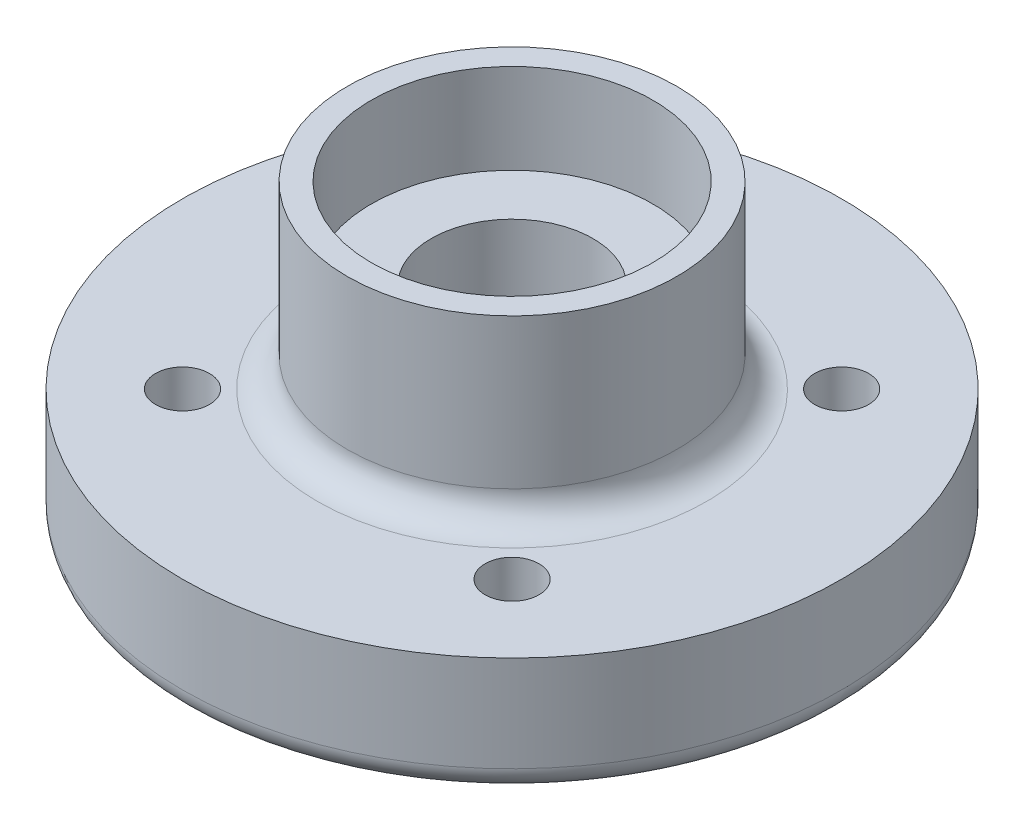
ISO-10303-21;
HEADER;
FILE_DESCRIPTION(('STEP AP214'),'2;1');
FILE_NAME('part.step','',(''),(''),'','','');
FILE_SCHEMA(('AUTOMOTIVE_DESIGN { 1 0 10303 214 1 1 1 1 }'));
ENDSEC;
DATA;
#1=APPLICATION_CONTEXT('core data for automotive mechanical design processes');
#2=APPLICATION_PROTOCOL_DEFINITION('international standard','automotive_design',2000,#1);
#3=PRODUCT_CONTEXT('',#1,'mechanical');
#4=PRODUCT('Part','Part','',(#3));
#5=PRODUCT_RELATED_PRODUCT_CATEGORY('part','',(#4));
#6=PRODUCT_DEFINITION_FORMATION('','',#4);
#7=PRODUCT_DEFINITION_CONTEXT('part definition',#1,'design');
#8=PRODUCT_DEFINITION('design','',#6,#7);
#9=PRODUCT_DEFINITION_SHAPE('','',#8);
#10=(LENGTH_UNIT() NAMED_UNIT(*) SI_UNIT(.MILLI.,.METRE.));
#11=(NAMED_UNIT(*) PLANE_ANGLE_UNIT() SI_UNIT($,.RADIAN.));
#12=(NAMED_UNIT(*) SI_UNIT($,.STERADIAN.) SOLID_ANGLE_UNIT());
#13=UNCERTAINTY_MEASURE_WITH_UNIT(LENGTH_MEASURE(1.E-05),#10,'distance_accuracy_value','');
#14=(GEOMETRIC_REPRESENTATION_CONTEXT(3) GLOBAL_UNCERTAINTY_ASSIGNED_CONTEXT((#13)) GLOBAL_UNIT_ASSIGNED_CONTEXT((#10,
#11,#12)) REPRESENTATION_CONTEXT('',''));
#15=CARTESIAN_POINT('',(0.,0.,0.));
#16=DIRECTION('',(0.,0.,1.));
#17=DIRECTION('',(1.,0.,0.));
#18=AXIS2_PLACEMENT_3D('',#15,#16,#17);
#19=CARTESIAN_POINT('',(0.,0.,0.));
#20=DIRECTION('',(0.,1.,0.));
#21=DIRECTION('',(0.,0.,1.));
#22=AXIS2_PLACEMENT_3D('',#19,#20,#21);
#23=PLANE('',#22);
#24=CARTESIAN_POINT('',(0.,0.,0.));
#25=DIRECTION('',(0.,1.,0.));
#26=DIRECTION('',(0.,0.,1.));
#27=AXIS2_PLACEMENT_3D('',#24,#25,#26);
#28=CIRCLE('',#27,27.5);
#29=CARTESIAN_POINT('',(0.,0.,27.5));
#30=VERTEX_POINT('',#29);
#31=EDGE_CURVE('E11',#30,#30,#28,.T.);
#32=ORIENTED_EDGE('',*,*,#31,.T.);
#33=EDGE_LOOP('',(#32));
#34=FACE_BOUND('',#33,.T.);
#35=CARTESIAN_POINT('',(-27.5,0.,-27.5));
#36=DIRECTION('',(0.,-1.,0.));
#37=DIRECTION('',(0.,0.,-1.));
#38=AXIS2_PLACEMENT_3D('',#35,#36,#37);
#39=CIRCLE('',#38,9.0055);
#40=CARTESIAN_POINT('',(-27.5,0.,-36.5055));
#41=VERTEX_POINT('',#40);
#42=EDGE_CURVE('E79',#41,#41,#39,.T.);
#43=ORIENTED_EDGE('',*,*,#42,.F.);
#44=EDGE_LOOP('',(#43));
#45=FACE_BOUND('',#44,.T.);
#46=CARTESIAN_POINT('',(27.5,0.,-27.5));
#47=DIRECTION('',(0.,-1.,0.));
#48=DIRECTION('',(0.,0.,-1.));
#49=AXIS2_PLACEMENT_3D('',#46,#47,#48);
#50=CIRCLE('',#49,9.0055);
#51=CARTESIAN_POINT('',(27.5,0.,-36.5055));
#52=VERTEX_POINT('',#51);
#53=EDGE_CURVE('E74',#52,#52,#50,.T.);
#54=ORIENTED_EDGE('',*,*,#53,.F.);
#55=EDGE_LOOP('',(#54));
#56=FACE_BOUND('',#55,.T.);
#57=CARTESIAN_POINT('',(27.5,0.,27.5));
#58=DIRECTION('',(0.,-1.,0.));
#59=DIRECTION('',(0.,0.,-1.));
#60=AXIS2_PLACEMENT_3D('',#57,#58,#59);
#61=CIRCLE('',#60,9.0055);
#62=CARTESIAN_POINT('',(27.5,0.,18.4945));
#63=VERTEX_POINT('',#62);
#64=EDGE_CURVE('E69',#63,#63,#61,.T.);
#65=ORIENTED_EDGE('',*,*,#64,.F.);
#66=EDGE_LOOP('',(#65));
#67=FACE_BOUND('',#66,.T.);
#68=CARTESIAN_POINT('',(-27.5,0.,27.5));
#69=DIRECTION('',(0.,-1.,0.));
#70=DIRECTION('',(0.,0.,-1.));
#71=AXIS2_PLACEMENT_3D('',#68,#69,#70);
#72=CIRCLE('',#71,9.0055);
#73=CARTESIAN_POINT('',(-27.5,0.,18.4945));
#74=VERTEX_POINT('',#73);
#75=EDGE_CURVE('E128',#74,#74,#72,.T.);
#76=ORIENTED_EDGE('',*,*,#75,.F.);
#77=EDGE_LOOP('',(#76));
#78=FACE_BOUND('',#77,.T.);
#79=CARTESIAN_POINT('',(0.,0.,0.));
#80=DIRECTION('',(0.,1.,0.));
#81=DIRECTION('',(0.,0.,1.));
#82=AXIS2_PLACEMENT_3D('',#79,#80,#81);
#83=CIRCLE('',#82,51.);
#84=CARTESIAN_POINT('',(0.,0.,51.));
#85=VERTEX_POINT('',#84);
#86=EDGE_CURVE('E59',#85,#85,#83,.F.);
#87=ORIENTED_EDGE('',*,*,#86,.T.);
#88=EDGE_LOOP('',(#87));
#89=FACE_BOUND('',#88,.T.);
#90=ADVANCED_FACE('F39',(#34,#45,#56,#67,#78,#89),#23,.F.);
#91=CARTESIAN_POINT('',(0.,20.,0.));
#92=DIRECTION('',(0.,-1.,0.));
#93=DIRECTION('',(0.,0.,-1.));
#94=AXIS2_PLACEMENT_3D('',#91,#92,#93);
#95=CYLINDRICAL_SURFACE('',#94,55.);
#96=CARTESIAN_POINT('',(0.,4.,0.));
#97=DIRECTION('',(0.,1.,0.));
#98=DIRECTION('',(0.,0.,1.));
#99=AXIS2_PLACEMENT_3D('',#96,#97,#98);
#100=CIRCLE('',#99,55.);
#101=CARTESIAN_POINT('',(0.,4.,55.));
#102=VERTEX_POINT('',#101);
#103=EDGE_CURVE('E62',#102,#102,#100,.T.);
#104=ORIENTED_EDGE('',*,*,#103,.T.);
#105=EDGE_LOOP('',(#104));
#106=FACE_BOUND('',#105,.T.);
#107=CARTESIAN_POINT('',(0.,20.,0.));
#108=DIRECTION('',(0.,1.,0.));
#109=DIRECTION('',(0.,0.,1.));
#110=AXIS2_PLACEMENT_3D('',#107,#108,#109);
#111=CIRCLE('',#110,55.);
#112=CARTESIAN_POINT('',(0.,20.,55.));
#113=VERTEX_POINT('',#112);
#114=EDGE_CURVE('E91',#113,#113,#111,.T.);
#115=ORIENTED_EDGE('',*,*,#114,.F.);
#116=EDGE_LOOP('',(#115));
#117=FACE_BOUND('',#116,.T.);
#118=ADVANCED_FACE('F155',(#106,#117),#95,.T.);
#119=CARTESIAN_POINT('',(0.,20.,0.));
#120=DIRECTION('',(0.,1.,0.));
#121=DIRECTION('',(0.,0.,1.));
#122=AXIS2_PLACEMENT_3D('',#119,#120,#121);
#123=PLANE('',#122);
#124=CARTESIAN_POINT('',(-27.5,20.,27.5));
#125=DIRECTION('',(0.,1.,0.));
#126=DIRECTION('',(0.,0.,1.));
#127=AXIS2_PLACEMENT_3D('',#124,#125,#126);
#128=CIRCLE('',#127,4.5);
#129=CARTESIAN_POINT('',(-27.5,20.,32.));
#130=VERTEX_POINT('',#129);
#131=EDGE_CURVE('E66',#130,#130,#128,.T.);
#132=ORIENTED_EDGE('',*,*,#131,.F.);
#133=EDGE_LOOP('',(#132));
#134=FACE_BOUND('',#133,.T.);
#135=CARTESIAN_POINT('',(27.5,20.,27.5));
#136=DIRECTION('',(0.,1.,0.));
#137=DIRECTION('',(0.,0.,1.));
#138=AXIS2_PLACEMENT_3D('',#135,#136,#137);
#139=CIRCLE('',#138,4.5);
#140=CARTESIAN_POINT('',(27.5,20.,32.));
#141=VERTEX_POINT('',#140);
#142=EDGE_CURVE('E71',#141,#141,#139,.T.);
#143=ORIENTED_EDGE('',*,*,#142,.F.);
#144=EDGE_LOOP('',(#143));
#145=FACE_BOUND('',#144,.T.);
#146=CARTESIAN_POINT('',(27.5,20.,-27.5));
#147=DIRECTION('',(0.,1.,0.));
#148=DIRECTION('',(0.,0.,1.));
#149=AXIS2_PLACEMENT_3D('',#146,#147,#148);
#150=CIRCLE('',#149,4.5);
#151=CARTESIAN_POINT('',(27.5,20.,-23.));
#152=VERTEX_POINT('',#151);
#153=EDGE_CURVE('E76',#152,#152,#150,.T.);
#154=ORIENTED_EDGE('',*,*,#153,.F.);
#155=EDGE_LOOP('',(#154));
#156=FACE_BOUND('',#155,.T.);
#157=CARTESIAN_POINT('',(-27.5,20.,-27.5));
#158=DIRECTION('',(0.,1.,0.));
#159=DIRECTION('',(0.,0.,1.));
#160=AXIS2_PLACEMENT_3D('',#157,#158,#159);
#161=CIRCLE('',#160,4.5);
#162=CARTESIAN_POINT('',(-27.5,20.,-23.));
#163=VERTEX_POINT('',#162);
#164=EDGE_CURVE('E81',#163,#163,#161,.T.);
#165=ORIENTED_EDGE('',*,*,#164,.F.);
#166=EDGE_LOOP('',(#165));
#167=FACE_BOUND('',#166,.T.);
#168=CARTESIAN_POINT('',(0.,20.,0.));
#169=DIRECTION('',(0.,1.,0.));
#170=DIRECTION('',(0.,0.,1.));
#171=AXIS2_PLACEMENT_3D('',#168,#169,#170);
#172=CIRCLE('',#171,32.5);
#173=CARTESIAN_POINT('',(0.,20.,32.5));
#174=VERTEX_POINT('',#173);
#175=EDGE_CURVE('E65',#174,#174,#172,.F.);
#176=ORIENTED_EDGE('',*,*,#175,.T.);
#177=EDGE_LOOP('',(#176));
#178=FACE_BOUND('',#177,.T.);
#179=ORIENTED_EDGE('',*,*,#114,.T.);
#180=EDGE_LOOP('',(#179));
#181=FACE_BOUND('',#180,.T.);
#182=ADVANCED_FACE('F160',(#134,#145,#156,#167,#178,#181),#123,.T.);
#183=CARTESIAN_POINT('',(0.,50.,0.));
#184=DIRECTION('',(0.,-1.,0.));
#185=DIRECTION('',(0.,0.,-1.));
#186=AXIS2_PLACEMENT_3D('',#183,#184,#185);
#187=CYLINDRICAL_SURFACE('',#186,27.5);
#188=CARTESIAN_POINT('',(0.,25.,0.));
#189=DIRECTION('',(0.,1.,0.));
#190=DIRECTION('',(0.,0.,1.));
#191=AXIS2_PLACEMENT_3D('',#188,#189,#190);
#192=CIRCLE('',#191,27.5);
#193=CARTESIAN_POINT('',(0.,25.,27.5));
#194=VERTEX_POINT('',#193);
#195=EDGE_CURVE('E88',#194,#194,#192,.T.);
#196=ORIENTED_EDGE('',*,*,#195,.T.);
#197=EDGE_LOOP('',(#196));
#198=FACE_BOUND('',#197,.T.);
#199=CARTESIAN_POINT('',(0.,50.,0.));
#200=DIRECTION('',(0.,1.,0.));
#201=DIRECTION('',(0.,0.,1.));
#202=AXIS2_PLACEMENT_3D('',#199,#200,#201);
#203=CIRCLE('',#202,27.5);
#204=CARTESIAN_POINT('',(0.,50.,27.5));
#205=VERTEX_POINT('',#204);
#206=EDGE_CURVE('E94',#205,#205,#203,.T.);
#207=ORIENTED_EDGE('',*,*,#206,.F.);
#208=EDGE_LOOP('',(#207));
#209=FACE_BOUND('',#208,.T.);
#210=ADVANCED_FACE('F366',(#198,#209),#187,.T.);
#211=CARTESIAN_POINT('',(0.,50.,0.));
#212=DIRECTION('',(0.,1.,0.));
#213=DIRECTION('',(0.,0.,1.));
#214=AXIS2_PLACEMENT_3D('',#211,#212,#213);
#215=PLANE('',#214);
#216=CARTESIAN_POINT('',(0.,50.,0.));
#217=DIRECTION('',(0.,1.,0.));
#218=DIRECTION('',(0.,0.,1.));
#219=AXIS2_PLACEMENT_3D('',#216,#217,#218);
#220=CIRCLE('',#219,23.5);
#221=CARTESIAN_POINT('',(0.,50.,23.5));
#222=VERTEX_POINT('',#221);
#223=EDGE_CURVE('E84',#222,#222,#220,.T.);
#224=ORIENTED_EDGE('',*,*,#223,.F.);
#225=EDGE_LOOP('',(#224));
#226=FACE_BOUND('',#225,.T.);
#227=ORIENTED_EDGE('',*,*,#206,.T.);
#228=EDGE_LOOP('',(#227));
#229=FACE_BOUND('',#228,.T.);
#230=ADVANCED_FACE('F380',(#226,#229),#215,.T.);
#231=CARTESIAN_POINT('',(0.,35.,0.));
#232=DIRECTION('',(0.,1.,0.));
#233=DIRECTION('',(0.,0.,1.));
#234=AXIS2_PLACEMENT_3D('',#231,#232,#233);
#235=CYLINDRICAL_SURFACE('',#234,23.5);
#236=CARTESIAN_POINT('',(0.,35.,0.));
#237=DIRECTION('',(0.,1.,0.));
#238=DIRECTION('',(0.,0.,1.));
#239=AXIS2_PLACEMENT_3D('',#236,#237,#238);
#240=CIRCLE('',#239,23.5);
#241=CARTESIAN_POINT('',(0.,35.,23.5));
#242=VERTEX_POINT('',#241);
#243=EDGE_CURVE('E97',#242,#242,#240,.T.);
#244=ORIENTED_EDGE('',*,*,#243,.F.);
#245=EDGE_LOOP('',(#244));
#246=FACE_BOUND('',#245,.T.);
#247=ORIENTED_EDGE('',*,*,#223,.T.);
#248=EDGE_LOOP('',(#247));
#249=FACE_BOUND('',#248,.T.);
#250=ADVANCED_FACE('F223',(#246,#249),#235,.F.);
#251=CARTESIAN_POINT('',(0.,35.,0.));
#252=DIRECTION('',(0.,1.,0.));
#253=DIRECTION('',(0.,0.,1.));
#254=AXIS2_PLACEMENT_3D('',#251,#252,#253);
#255=PLANE('',#254);
#256=CARTESIAN_POINT('',(0.,35.,0.));
#257=DIRECTION('',(0.,1.,0.));
#258=DIRECTION('',(0.,0.,1.));
#259=AXIS2_PLACEMENT_3D('',#256,#257,#258);
#260=CIRCLE('',#259,13.5);
#261=CARTESIAN_POINT('',(0.,35.,13.5));
#262=VERTEX_POINT('',#261);
#263=EDGE_CURVE('E131',#262,#262,#260,.T.);
#264=ORIENTED_EDGE('',*,*,#263,.F.);
#265=EDGE_LOOP('',(#264));
#266=FACE_BOUND('',#265,.T.);
#267=ORIENTED_EDGE('',*,*,#243,.T.);
#268=EDGE_LOOP('',(#267));
#269=FACE_BOUND('',#268,.T.);
#270=ADVANCED_FACE('F171',(#266,#269),#255,.T.);
#271=CARTESIAN_POINT('',(0.,25.,0.));
#272=DIRECTION('',(0.,1.,0.));
#273=DIRECTION('',(0.,0.,1.));
#274=AXIS2_PLACEMENT_3D('',#271,#272,#273);
#275=TOROIDAL_SURFACE('',#274,32.5,5.);
#276=ORIENTED_EDGE('',*,*,#175,.F.);
#277=EDGE_LOOP('',(#276));
#278=FACE_BOUND('',#277,.T.);
#279=ORIENTED_EDGE('',*,*,#195,.F.);
#280=EDGE_LOOP('',(#279));
#281=FACE_BOUND('',#280,.T.);
#282=ADVANCED_FACE('F167',(#278,#281),#275,.F.);
#283=CARTESIAN_POINT('',(-27.5,0.,-27.5));
#284=DIRECTION('',(0.,-1.,0.));
#285=DIRECTION('',(0.,0.,-1.));
#286=AXIS2_PLACEMENT_3D('',#283,#284,#285);
#287=CYLINDRICAL_SURFACE('',#286,4.5);
#288=ORIENTED_EDGE('',*,*,#164,.T.);
#289=EDGE_LOOP('',(#288));
#290=FACE_BOUND('',#289,.T.);
#291=CARTESIAN_POINT('',(-27.5,5.3,-27.5));
#292=DIRECTION('',(0.,-1.,0.));
#293=DIRECTION('',(0.,0.,-1.));
#294=AXIS2_PLACEMENT_3D('',#291,#292,#293);
#295=CIRCLE('',#294,4.50000000000001);
#296=CARTESIAN_POINT('',(-27.5,5.3,-32.));
#297=VERTEX_POINT('',#296);
#298=EDGE_CURVE('E85',#297,#297,#295,.T.);
#299=ORIENTED_EDGE('',*,*,#298,.T.);
#300=EDGE_LOOP('',(#299));
#301=FACE_BOUND('',#300,.T.);
#302=ADVANCED_FACE('F170',(#290,#301),#287,.F.);
#303=CARTESIAN_POINT('',(-23.,5.3,-27.5));
#304=DIRECTION('',(0.,1.,0.));
#305=DIRECTION('',(0.,0.,1.));
#306=AXIS2_PLACEMENT_3D('',#303,#304,#305);
#307=PLANE('',#306);
#308=ORIENTED_EDGE('',*,*,#298,.F.);
#309=EDGE_LOOP('',(#308));
#310=FACE_BOUND('',#309,.T.);
#311=CARTESIAN_POINT('',(-27.5,5.3,-27.5));
#312=DIRECTION('',(0.,-1.,0.));
#313=DIRECTION('',(0.,0.,-1.));
#314=AXIS2_PLACEMENT_3D('',#311,#312,#313);
#315=CIRCLE('',#314,9.0055);
#316=CARTESIAN_POINT('',(-27.5,5.3,-36.5055));
#317=VERTEX_POINT('',#316);
#318=EDGE_CURVE('E104',#317,#317,#315,.T.);
#319=ORIENTED_EDGE('',*,*,#318,.T.);
#320=EDGE_LOOP('',(#319));
#321=FACE_BOUND('',#320,.T.);
#322=ADVANCED_FACE('F340',(#310,#321),#307,.F.);
#323=CARTESIAN_POINT('',(-27.5,0.,-27.5));
#324=DIRECTION('',(0.,-1.,0.));
#325=DIRECTION('',(0.,0.,-1.));
#326=AXIS2_PLACEMENT_3D('',#323,#324,#325);
#327=CYLINDRICAL_SURFACE('',#326,9.0055);
#328=ORIENTED_EDGE('',*,*,#318,.F.);
#329=EDGE_LOOP('',(#328));
#330=FACE_BOUND('',#329,.T.);
#331=ORIENTED_EDGE('',*,*,#42,.T.);
#332=EDGE_LOOP('',(#331));
#333=FACE_BOUND('',#332,.T.);
#334=ADVANCED_FACE('F330',(#330,#333),#327,.F.);
#335=CARTESIAN_POINT('',(27.5,0.,-27.5));
#336=DIRECTION('',(0.,-1.,0.));
#337=DIRECTION('',(0.,0.,-1.));
#338=AXIS2_PLACEMENT_3D('',#335,#336,#337);
#339=CYLINDRICAL_SURFACE('',#338,4.5);
#340=ORIENTED_EDGE('',*,*,#153,.T.);
#341=EDGE_LOOP('',(#340));
#342=FACE_BOUND('',#341,.T.);
#343=CARTESIAN_POINT('',(27.5,5.3,-27.5));
#344=DIRECTION('',(0.,-1.,0.));
#345=DIRECTION('',(0.,0.,-1.));
#346=AXIS2_PLACEMENT_3D('',#343,#344,#345);
#347=CIRCLE('',#346,4.50000000000001);
#348=CARTESIAN_POINT('',(27.5,5.3,-32.));
#349=VERTEX_POINT('',#348);
#350=EDGE_CURVE('E80',#349,#349,#347,.T.);
#351=ORIENTED_EDGE('',*,*,#350,.T.);
#352=EDGE_LOOP('',(#351));
#353=FACE_BOUND('',#352,.T.);
#354=ADVANCED_FACE('F320',(#342,#353),#339,.F.);
#355=CARTESIAN_POINT('',(32.,5.3,-27.5));
#356=DIRECTION('',(0.,1.,0.));
#357=DIRECTION('',(0.,0.,1.));
#358=AXIS2_PLACEMENT_3D('',#355,#356,#357);
#359=PLANE('',#358);
#360=ORIENTED_EDGE('',*,*,#350,.F.);
#361=EDGE_LOOP('',(#360));
#362=FACE_BOUND('',#361,.T.);
#363=CARTESIAN_POINT('',(27.5,5.3,-27.5));
#364=DIRECTION('',(0.,-1.,0.));
#365=DIRECTION('',(0.,0.,-1.));
#366=AXIS2_PLACEMENT_3D('',#363,#364,#365);
#367=CIRCLE('',#366,9.0055);
#368=CARTESIAN_POINT('',(27.5,5.3,-36.5055));
#369=VERTEX_POINT('',#368);
#370=EDGE_CURVE('E111',#369,#369,#367,.T.);
#371=ORIENTED_EDGE('',*,*,#370,.T.);
#372=EDGE_LOOP('',(#371));
#373=FACE_BOUND('',#372,.T.);
#374=ADVANCED_FACE('F310',(#362,#373),#359,.F.);
#375=CARTESIAN_POINT('',(27.5,0.,-27.5));
#376=DIRECTION('',(0.,-1.,0.));
#377=DIRECTION('',(0.,0.,-1.));
#378=AXIS2_PLACEMENT_3D('',#375,#376,#377);
#379=CYLINDRICAL_SURFACE('',#378,9.0055);
#380=ORIENTED_EDGE('',*,*,#370,.F.);
#381=EDGE_LOOP('',(#380));
#382=FACE_BOUND('',#381,.T.);
#383=ORIENTED_EDGE('',*,*,#53,.T.);
#384=EDGE_LOOP('',(#383));
#385=FACE_BOUND('',#384,.T.);
#386=ADVANCED_FACE('F300',(#382,#385),#379,.F.);
#387=CARTESIAN_POINT('',(27.5,0.,27.5));
#388=DIRECTION('',(0.,-1.,0.));
#389=DIRECTION('',(0.,0.,-1.));
#390=AXIS2_PLACEMENT_3D('',#387,#388,#389);
#391=CYLINDRICAL_SURFACE('',#390,4.5);
#392=ORIENTED_EDGE('',*,*,#142,.T.);
#393=EDGE_LOOP('',(#392));
#394=FACE_BOUND('',#393,.T.);
#395=CARTESIAN_POINT('',(27.5,5.3,27.5));
#396=DIRECTION('',(0.,-1.,0.));
#397=DIRECTION('',(0.,0.,-1.));
#398=AXIS2_PLACEMENT_3D('',#395,#396,#397);
#399=CIRCLE('',#398,4.50000000000001);
#400=CARTESIAN_POINT('',(27.5,5.3,23.));
#401=VERTEX_POINT('',#400);
#402=EDGE_CURVE('E75',#401,#401,#399,.T.);
#403=ORIENTED_EDGE('',*,*,#402,.T.);
#404=EDGE_LOOP('',(#403));
#405=FACE_BOUND('',#404,.T.);
#406=ADVANCED_FACE('F290',(#394,#405),#391,.F.);
#407=CARTESIAN_POINT('',(32.,5.3,27.5));
#408=DIRECTION('',(0.,1.,0.));
#409=DIRECTION('',(0.,0.,1.));
#410=AXIS2_PLACEMENT_3D('',#407,#408,#409);
#411=PLANE('',#410);
#412=ORIENTED_EDGE('',*,*,#402,.F.);
#413=EDGE_LOOP('',(#412));
#414=FACE_BOUND('',#413,.T.);
#415=CARTESIAN_POINT('',(27.5,5.3,27.5));
#416=DIRECTION('',(0.,-1.,0.));
#417=DIRECTION('',(0.,0.,-1.));
#418=AXIS2_PLACEMENT_3D('',#415,#416,#417);
#419=CIRCLE('',#418,9.0055);
#420=CARTESIAN_POINT('',(27.5,5.3,18.4945));
#421=VERTEX_POINT('',#420);
#422=EDGE_CURVE('E118',#421,#421,#419,.T.);
#423=ORIENTED_EDGE('',*,*,#422,.T.);
#424=EDGE_LOOP('',(#423));
#425=FACE_BOUND('',#424,.T.);
#426=ADVANCED_FACE('F280',(#414,#425),#411,.F.);
#427=CARTESIAN_POINT('',(27.5,0.,27.5));
#428=DIRECTION('',(0.,-1.,0.));
#429=DIRECTION('',(0.,0.,-1.));
#430=AXIS2_PLACEMENT_3D('',#427,#428,#429);
#431=CYLINDRICAL_SURFACE('',#430,9.0055);
#432=ORIENTED_EDGE('',*,*,#422,.F.);
#433=EDGE_LOOP('',(#432));
#434=FACE_BOUND('',#433,.T.);
#435=ORIENTED_EDGE('',*,*,#64,.T.);
#436=EDGE_LOOP('',(#435));
#437=FACE_BOUND('',#436,.T.);
#438=ADVANCED_FACE('F270',(#434,#437),#431,.F.);
#439=CARTESIAN_POINT('',(-27.5,0.,27.5));
#440=DIRECTION('',(0.,-1.,0.));
#441=DIRECTION('',(0.,0.,-1.));
#442=AXIS2_PLACEMENT_3D('',#439,#440,#441);
#443=CYLINDRICAL_SURFACE('',#442,4.5);
#444=ORIENTED_EDGE('',*,*,#131,.T.);
#445=EDGE_LOOP('',(#444));
#446=FACE_BOUND('',#445,.T.);
#447=CARTESIAN_POINT('',(-27.5,5.3,27.5));
#448=DIRECTION('',(0.,-1.,0.));
#449=DIRECTION('',(0.,0.,-1.));
#450=AXIS2_PLACEMENT_3D('',#447,#448,#449);
#451=CIRCLE('',#450,4.50000000000001);
#452=CARTESIAN_POINT('',(-27.5,5.3,23.));
#453=VERTEX_POINT('',#452);
#454=EDGE_CURVE('E70',#453,#453,#451,.T.);
#455=ORIENTED_EDGE('',*,*,#454,.T.);
#456=EDGE_LOOP('',(#455));
#457=FACE_BOUND('',#456,.T.);
#458=ADVANCED_FACE('F260',(#446,#457),#443,.F.);
#459=CARTESIAN_POINT('',(-23.,5.3,27.5));
#460=DIRECTION('',(0.,1.,0.));
#461=DIRECTION('',(0.,0.,1.));
#462=AXIS2_PLACEMENT_3D('',#459,#460,#461);
#463=PLANE('',#462);
#464=ORIENTED_EDGE('',*,*,#454,.F.);
#465=EDGE_LOOP('',(#464));
#466=FACE_BOUND('',#465,.T.);
#467=CARTESIAN_POINT('',(-27.5,5.3,27.5));
#468=DIRECTION('',(0.,-1.,0.));
#469=DIRECTION('',(0.,0.,-1.));
#470=AXIS2_PLACEMENT_3D('',#467,#468,#469);
#471=CIRCLE('',#470,9.0055);
#472=CARTESIAN_POINT('',(-27.5,5.3,18.4945));
#473=VERTEX_POINT('',#472);
#474=EDGE_CURVE('E125',#473,#473,#471,.T.);
#475=ORIENTED_EDGE('',*,*,#474,.T.);
#476=EDGE_LOOP('',(#475));
#477=FACE_BOUND('',#476,.T.);
#478=ADVANCED_FACE('F250',(#466,#477),#463,.F.);
#479=CARTESIAN_POINT('',(-27.5,0.,27.5));
#480=DIRECTION('',(0.,-1.,0.));
#481=DIRECTION('',(0.,0.,-1.));
#482=AXIS2_PLACEMENT_3D('',#479,#480,#481);
#483=CYLINDRICAL_SURFACE('',#482,9.0055);
#484=ORIENTED_EDGE('',*,*,#474,.F.);
#485=EDGE_LOOP('',(#484));
#486=FACE_BOUND('',#485,.T.);
#487=ORIENTED_EDGE('',*,*,#75,.T.);
#488=EDGE_LOOP('',(#487));
#489=FACE_BOUND('',#488,.T.);
#490=ADVANCED_FACE('F174',(#486,#489),#483,.F.);
#491=CARTESIAN_POINT('',(0.,4.,0.));
#492=DIRECTION('',(0.,1.,0.));
#493=DIRECTION('',(0.,0.,1.));
#494=AXIS2_PLACEMENT_3D('',#491,#492,#493);
#495=TOROIDAL_SURFACE('',#494,51.,4.);
#496=ORIENTED_EDGE('',*,*,#86,.F.);
#497=EDGE_LOOP('',(#496));
#498=FACE_BOUND('',#497,.T.);
#499=ORIENTED_EDGE('',*,*,#103,.F.);
#500=EDGE_LOOP('',(#499));
#501=FACE_BOUND('',#500,.T.);
#502=ADVANCED_FACE('F151',(#498,#501),#495,.T.);
#503=CARTESIAN_POINT('',(0.,-18.,0.));
#504=DIRECTION('',(0.,1.,0.));
#505=DIRECTION('',(0.,0.,1.));
#506=AXIS2_PLACEMENT_3D('',#503,#504,#505);
#507=CYLINDRICAL_SURFACE('',#506,13.5);
#508=ORIENTED_EDGE('',*,*,#263,.T.);
#509=EDGE_LOOP('',(#508));
#510=FACE_BOUND('',#509,.T.);
#511=CARTESIAN_POINT('',(0.,-15.,0.));
#512=DIRECTION('',(0.,-1.,0.));
#513=DIRECTION('',(0.,0.,-1.));
#514=AXIS2_PLACEMENT_3D('',#511,#512,#513);
#515=CIRCLE('',#514,13.5);
#516=CARTESIAN_POINT('',(0.,-15.,-13.5));
#517=VERTEX_POINT('',#516);
#518=EDGE_CURVE('E134',#517,#517,#515,.T.);
#519=ORIENTED_EDGE('',*,*,#518,.T.);
#520=EDGE_LOOP('',(#519));
#521=FACE_BOUND('',#520,.T.);
#522=ADVANCED_FACE('F138',(#510,#521),#507,.F.);
#523=CARTESIAN_POINT('',(0.,-15.,0.));
#524=DIRECTION('',(0.,-1.,0.));
#525=DIRECTION('',(0.,0.,-1.));
#526=AXIS2_PLACEMENT_3D('',#523,#524,#525);
#527=PLANE('',#526);
#528=CARTESIAN_POINT('',(0.,-15.,0.));
#529=DIRECTION('',(0.,-1.,0.));
#530=DIRECTION('',(0.,0.,-1.));
#531=AXIS2_PLACEMENT_3D('',#528,#529,#530);
#532=CIRCLE('',#531,17.5);
#533=CARTESIAN_POINT('',(0.,-15.,-17.5));
#534=VERTEX_POINT('',#533);
#535=EDGE_CURVE('E54',#534,#534,#532,.T.);
#536=ORIENTED_EDGE('',*,*,#535,.T.);
#537=EDGE_LOOP('',(#536));
#538=FACE_BOUND('',#537,.T.);
#539=ORIENTED_EDGE('',*,*,#518,.F.);
#540=EDGE_LOOP('',(#539));
#541=FACE_BOUND('',#540,.T.);
#542=ADVANCED_FACE('F140',(#538,#541),#527,.T.);
#543=CARTESIAN_POINT('',(0.,-15.,0.));
#544=DIRECTION('',(0.,1.,0.));
#545=DIRECTION('',(0.,0.,1.));
#546=AXIS2_PLACEMENT_3D('',#543,#544,#545);
#547=CYLINDRICAL_SURFACE('',#546,22.5);
#548=CARTESIAN_POINT('',(0.,-10.,0.));
#549=DIRECTION('',(0.,-1.,0.));
#550=DIRECTION('',(0.,0.,-1.));
#551=AXIS2_PLACEMENT_3D('',#548,#549,#550);
#552=CIRCLE('',#551,22.5);
#553=CARTESIAN_POINT('',(0.,-10.,-22.5));
#554=VERTEX_POINT('',#553);
#555=EDGE_CURVE('E46',#554,#554,#552,.F.);
#556=ORIENTED_EDGE('',*,*,#555,.T.);
#557=EDGE_LOOP('',(#556));
#558=FACE_BOUND('',#557,.T.);
#559=CARTESIAN_POINT('',(0.,-5.,0.));
#560=DIRECTION('',(0.,1.,0.));
#561=DIRECTION('',(0.,0.,1.));
#562=AXIS2_PLACEMENT_3D('',#559,#560,#561);
#563=CIRCLE('',#562,22.5);
#564=CARTESIAN_POINT('',(0.,-5.,22.5));
#565=VERTEX_POINT('',#564);
#566=EDGE_CURVE('E50',#565,#565,#563,.F.);
#567=ORIENTED_EDGE('',*,*,#566,.T.);
#568=EDGE_LOOP('',(#567));
#569=FACE_BOUND('',#568,.T.);
#570=ADVANCED_FACE('F142',(#558,#569),#547,.T.);
#571=CARTESIAN_POINT('',(0.,-10.,0.));
#572=DIRECTION('',(0.,-1.,0.));
#573=DIRECTION('',(0.,0.,-1.));
#574=AXIS2_PLACEMENT_3D('',#571,#572,#573);
#575=TOROIDAL_SURFACE('',#574,17.5,5.);
#576=ORIENTED_EDGE('',*,*,#555,.F.);
#577=EDGE_LOOP('',(#576));
#578=FACE_BOUND('',#577,.T.);
#579=ORIENTED_EDGE('',*,*,#535,.F.);
#580=EDGE_LOOP('',(#579));
#581=FACE_BOUND('',#580,.T.);
#582=ADVANCED_FACE('F149',(#578,#581),#575,.T.);
#583=CARTESIAN_POINT('',(0.,-5.,0.));
#584=DIRECTION('',(0.,1.,0.));
#585=DIRECTION('',(0.,0.,1.));
#586=AXIS2_PLACEMENT_3D('',#583,#584,#585);
#587=TOROIDAL_SURFACE('',#586,27.5,5.);
#588=ORIENTED_EDGE('',*,*,#31,.F.);
#589=EDGE_LOOP('',(#588));
#590=FACE_BOUND('',#589,.T.);
#591=ORIENTED_EDGE('',*,*,#566,.F.);
#592=EDGE_LOOP('',(#591));
#593=FACE_BOUND('',#592,.T.);
#594=ADVANCED_FACE('F41',(#590,#593),#587,.F.);
#595=CLOSED_SHELL('',(#90,#118,#182,#210,#230,#250,#270,#282,#302,#322,#334,#354,#374,#386,#406,
#426,#438,#458,#478,#490,#502,#522,#542,#570,#582,#594));
#596=MANIFOLD_SOLID_BREP('B2',#595);
#597=ADVANCED_BREP_SHAPE_REPRESENTATION('',(#18,#596),#14);
#598=SHAPE_DEFINITION_REPRESENTATION(#9,#597);
ENDSEC;
END-ISO-10303-21;
